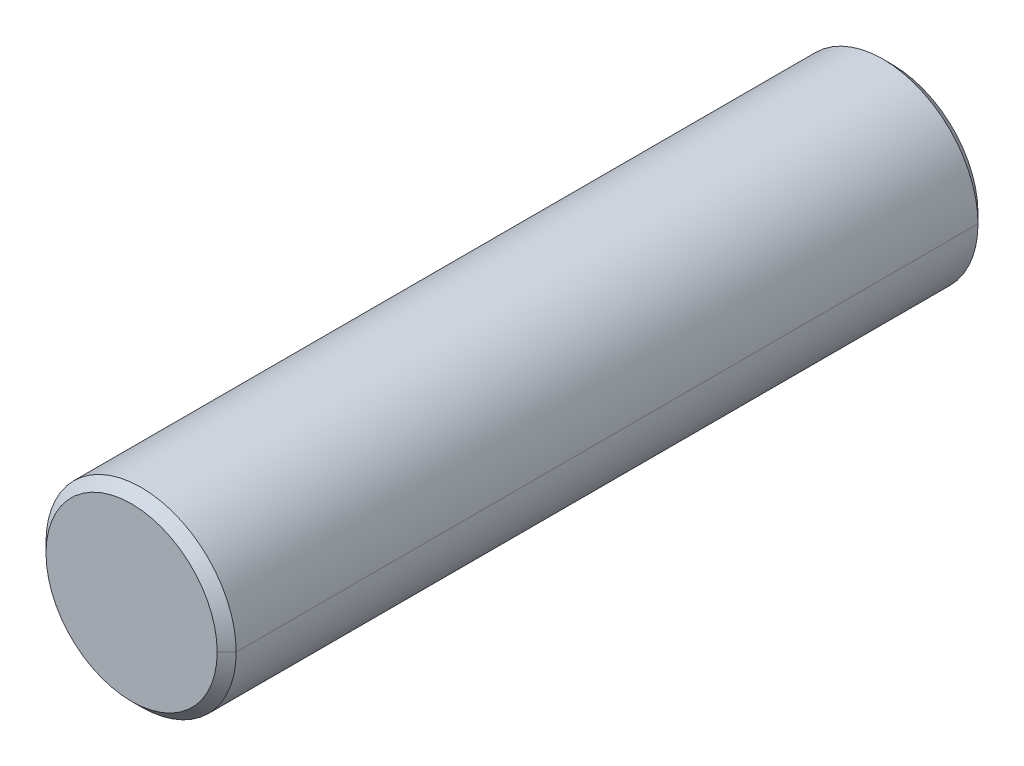
ISO-10303-21;
HEADER;
FILE_DESCRIPTION(('STEP AP214'),'2;1');
FILE_NAME('part.step','',(''),(''),'','','');
FILE_SCHEMA(('AUTOMOTIVE_DESIGN { 1 0 10303 214 1 1 1 1 }'));
ENDSEC;
DATA;
#1=APPLICATION_CONTEXT('core data for automotive mechanical design processes');
#2=APPLICATION_PROTOCOL_DEFINITION('international standard','automotive_design',2000,#1);
#3=PRODUCT_CONTEXT('',#1,'mechanical');
#4=PRODUCT('Part','Part','',(#3));
#5=PRODUCT_RELATED_PRODUCT_CATEGORY('part','',(#4));
#6=PRODUCT_DEFINITION_FORMATION('','',#4);
#7=PRODUCT_DEFINITION_CONTEXT('part definition',#1,'design');
#8=PRODUCT_DEFINITION('design','',#6,#7);
#9=PRODUCT_DEFINITION_SHAPE('','',#8);
#10=(LENGTH_UNIT() NAMED_UNIT(*) SI_UNIT(.MILLI.,.METRE.));
#11=(NAMED_UNIT(*) PLANE_ANGLE_UNIT() SI_UNIT($,.RADIAN.));
#12=(NAMED_UNIT(*) SI_UNIT($,.STERADIAN.) SOLID_ANGLE_UNIT());
#13=UNCERTAINTY_MEASURE_WITH_UNIT(LENGTH_MEASURE(1.E-05),#10,'distance_accuracy_value','');
#14=(GEOMETRIC_REPRESENTATION_CONTEXT(3) GLOBAL_UNCERTAINTY_ASSIGNED_CONTEXT((#13)) GLOBAL_UNIT_ASSIGNED_CONTEXT((#10,
#11,#12)) REPRESENTATION_CONTEXT('',''));
#15=CARTESIAN_POINT('',(0.,0.,0.));
#16=DIRECTION('',(0.,0.,1.));
#17=DIRECTION('',(1.,0.,0.));
#18=AXIS2_PLACEMENT_3D('',#15,#16,#17);
#19=CARTESIAN_POINT('',(12.01043392265,4.974884620748,42.5));
#20=DIRECTION('',(0.,0.,1.));
#21=DIRECTION('',(-1.,0.,0.));
#22=AXIS2_PLACEMENT_3D('',#19,#20,#21);
#23=CYLINDRICAL_SURFACE('',#22,1.);
#24=DIRECTION('',(0.,0.,-1.));
#25=VECTOR('',#24,1.);
#26=CARTESIAN_POINT('',(13.01043392265,4.97488462107097,50.4));
#27=LINE('',#26,#25);
#28=CARTESIAN_POINT('',(13.01043392265,4.9748846210472,50.4));
#29=VERTEX_POINT('',#28);
#30=CARTESIAN_POINT('',(13.01043392265,4.97488462107097,42.6));
#31=VERTEX_POINT('',#30);
#32=EDGE_CURVE('E120',#29,#31,#27,.T.);
#33=ORIENTED_EDGE('',*,*,#32,.T.);
#34=CARTESIAN_POINT('',(12.01043392265,4.974884620748,42.6));
#35=DIRECTION('',(0.,0.,1.));
#36=DIRECTION('',(1.,2.99203206315E-10,0.));
#37=AXIS2_PLACEMENT_3D('',#34,#35,#36);
#38=CIRCLE('',#37,1.);
#39=CARTESIAN_POINT('',(12.01043392265,5.974884620748,42.6));
#40=VERTEX_POINT('',#39);
#41=EDGE_CURVE('E125',#31,#40,#38,.T.);
#42=ORIENTED_EDGE('',*,*,#41,.T.);
#43=CARTESIAN_POINT('',(12.01043392265,4.974884620748,42.6));
#44=DIRECTION('',(0.,0.,1.));
#45=DIRECTION('',(0.,1.,0.));
#46=AXIS2_PLACEMENT_3D('',#43,#44,#45);
#47=CIRCLE('',#46,1.);
#48=CARTESIAN_POINT('',(11.01043392265,4.974884620748,42.6));
#49=VERTEX_POINT('',#48);
#50=EDGE_CURVE('E126',#40,#49,#47,.T.);
#51=ORIENTED_EDGE('',*,*,#50,.T.);
#52=DIRECTION('',(0.,0.,-1.));
#53=VECTOR('',#52,1.);
#54=CARTESIAN_POINT('',(11.01043392265,4.97488462057463,50.4));
#55=LINE('',#54,#53);
#56=CARTESIAN_POINT('',(11.01043392265,4.974884620748,50.4));
#57=VERTEX_POINT('',#56);
#58=EDGE_CURVE('E115',#57,#49,#55,.T.);
#59=ORIENTED_EDGE('',*,*,#58,.F.);
#60=CARTESIAN_POINT('',(12.01043392265,4.974884620748,50.4));
#61=DIRECTION('',(0.,0.,-1.));
#62=DIRECTION('',(-1.,0.,0.));
#63=AXIS2_PLACEMENT_3D('',#60,#61,#62);
#64=CIRCLE('',#63,1.);
#65=CARTESIAN_POINT('',(12.01043392265,5.974884620748,50.4));
#66=VERTEX_POINT('',#65);
#67=EDGE_CURVE('E11',#57,#66,#64,.T.);
#68=ORIENTED_EDGE('',*,*,#67,.T.);
#69=CARTESIAN_POINT('',(12.01043392265,4.974884620748,50.4));
#70=DIRECTION('',(0.,0.,-1.));
#71=DIRECTION('',(0.,1.,0.));
#72=AXIS2_PLACEMENT_3D('',#69,#70,#71);
#73=CIRCLE('',#72,1.);
#74=EDGE_CURVE('E27',#66,#29,#73,.T.);
#75=ORIENTED_EDGE('',*,*,#74,.T.);
#76=EDGE_LOOP('',(#33,#42,#51,#59,#68,#75));
#77=FACE_BOUND('',#76,.T.);
#78=ADVANCED_FACE('F16',(#77),#23,.T.);
#79=CARTESIAN_POINT('',(12.01043392265,4.974884620748,50.45));
#80=DIRECTION('',(0.,0.,-1.));
#81=DIRECTION('',(0.,-1.,0.));
#82=AXIS2_PLACEMENT_3D('',#79,#80,#81);
#83=CONICAL_SURFACE('',#82,0.95,0.785398163397);
#84=DIRECTION('',(-0.707106781187048,-8.12663181269155E-10,0.707106781186048));
#85=VECTOR('',#84,1.);
#86=CARTESIAN_POINT('',(13.01043392265,4.97488462107097,50.4));
#87=LINE('',#86,#85);
#88=CARTESIAN_POINT('',(12.91043392265,4.974884620748,50.5));
#89=VERTEX_POINT('',#88);
#90=EDGE_CURVE('E94',#29,#89,#87,.T.);
#91=ORIENTED_EDGE('',*,*,#90,.F.);
#92=ORIENTED_EDGE('',*,*,#74,.F.);
#93=ORIENTED_EDGE('',*,*,#67,.F.);
#94=DIRECTION('',(0.707106781187048,-2.45180332399316E-10,0.707106781186048));
#95=VECTOR('',#94,1.);
#96=CARTESIAN_POINT('',(11.01043392265,4.97488462057463,50.4));
#97=LINE('',#96,#95);
#98=CARTESIAN_POINT('',(11.11043392265,4.974884620748,50.5));
#99=VERTEX_POINT('',#98);
#100=EDGE_CURVE('E101',#57,#99,#97,.T.);
#101=ORIENTED_EDGE('',*,*,#100,.T.);
#102=CARTESIAN_POINT('',(12.01043392265,4.974884620748,50.5));
#103=DIRECTION('',(0.,0.,-1.));
#104=DIRECTION('',(-1.,0.,0.));
#105=AXIS2_PLACEMENT_3D('',#102,#103,#104);
#106=CIRCLE('',#105,0.9);
#107=CARTESIAN_POINT('',(12.01043392265,5.874884620748,50.5));
#108=VERTEX_POINT('',#107);
#109=EDGE_CURVE('E84',#99,#108,#106,.T.);
#110=ORIENTED_EDGE('',*,*,#109,.T.);
#111=CARTESIAN_POINT('',(12.01043392265,4.974884620748,50.5));
#112=DIRECTION('',(0.,0.,-1.));
#113=DIRECTION('',(0.,1.,0.));
#114=AXIS2_PLACEMENT_3D('',#111,#112,#113);
#115=CIRCLE('',#114,0.9);
#116=EDGE_CURVE('E89',#108,#89,#115,.T.);
#117=ORIENTED_EDGE('',*,*,#116,.T.);
#118=EDGE_LOOP('',(#91,#92,#93,#101,#110,#117));
#119=FACE_BOUND('',#118,.T.);
#120=ADVANCED_FACE('F205',(#119),#83,.T.);
#121=CARTESIAN_POINT('',(12.01043392265,4.974884620748,50.5));
#122=DIRECTION('',(0.,0.,1.));
#123=DIRECTION('',(1.,0.,0.));
#124=AXIS2_PLACEMENT_3D('',#121,#122,#123);
#125=PLANE('',#124);
#126=CARTESIAN_POINT('',(12.01043392265,4.974884620748,50.5));
#127=DIRECTION('',(0.,0.,-1.));
#128=DIRECTION('',(0.,-1.,0.));
#129=AXIS2_PLACEMENT_3D('',#126,#127,#128);
#130=CIRCLE('',#129,0.9);
#131=CARTESIAN_POINT('',(12.01043392265,4.074884620748,50.5));
#132=VERTEX_POINT('',#131);
#133=EDGE_CURVE('E78',#132,#99,#130,.T.);
#134=ORIENTED_EDGE('',*,*,#133,.F.);
#135=CARTESIAN_POINT('',(12.01043392265,4.974884620748,50.5));
#136=DIRECTION('',(0.,0.,-1.));
#137=DIRECTION('',(1.,0.,0.));
#138=AXIS2_PLACEMENT_3D('',#135,#136,#137);
#139=CIRCLE('',#138,0.9);
#140=EDGE_CURVE('E82',#89,#132,#139,.T.);
#141=ORIENTED_EDGE('',*,*,#140,.F.);
#142=ORIENTED_EDGE('',*,*,#116,.F.);
#143=ORIENTED_EDGE('',*,*,#109,.F.);
#144=EDGE_LOOP('',(#134,#141,#142,#143));
#145=FACE_BOUND('',#144,.T.);
#146=ADVANCED_FACE('F80',(#145),#125,.T.);
#147=CARTESIAN_POINT('',(12.01043392265,4.974884620748,50.45));
#148=DIRECTION('',(0.,0.,-1.));
#149=DIRECTION('',(0.,-1.,0.));
#150=AXIS2_PLACEMENT_3D('',#147,#148,#149);
#151=CONICAL_SURFACE('',#150,0.95,0.785398163397);
#152=ORIENTED_EDGE('',*,*,#100,.F.);
#153=CARTESIAN_POINT('',(12.01043392265,4.974884620748,50.4));
#154=DIRECTION('',(0.,0.,-1.));
#155=DIRECTION('',(0.,-1.,0.));
#156=AXIS2_PLACEMENT_3D('',#153,#154,#155);
#157=CIRCLE('',#156,1.);
#158=CARTESIAN_POINT('',(12.01043392265,3.974884620748,50.4));
#159=VERTEX_POINT('',#158);
#160=EDGE_CURVE('E119',#159,#57,#157,.T.);
#161=ORIENTED_EDGE('',*,*,#160,.F.);
#162=CARTESIAN_POINT('',(12.01043392265,4.974884620748,50.4));
#163=DIRECTION('',(0.,0.,-1.));
#164=DIRECTION('',(1.,2.99203206315E-10,0.));
#165=AXIS2_PLACEMENT_3D('',#162,#163,#164);
#166=CIRCLE('',#165,1.);
#167=EDGE_CURVE('E116',#29,#159,#166,.T.);
#168=ORIENTED_EDGE('',*,*,#167,.F.);
#169=ORIENTED_EDGE('',*,*,#90,.T.);
#170=ORIENTED_EDGE('',*,*,#140,.T.);
#171=ORIENTED_EDGE('',*,*,#133,.T.);
#172=EDGE_LOOP('',(#152,#161,#168,#169,#170,#171));
#173=FACE_BOUND('',#172,.T.);
#174=ADVANCED_FACE('F91',(#173),#151,.T.);
#175=CARTESIAN_POINT('',(12.01043392265,4.974884620748,42.5));
#176=DIRECTION('',(0.,0.,1.));
#177=DIRECTION('',(-1.,0.,0.));
#178=AXIS2_PLACEMENT_3D('',#175,#176,#177);
#179=CYLINDRICAL_SURFACE('',#178,1.);
#180=ORIENTED_EDGE('',*,*,#58,.T.);
#181=CARTESIAN_POINT('',(12.01043392265,4.974884620748,42.6));
#182=DIRECTION('',(0.,0.,1.));
#183=DIRECTION('',(-1.,0.,0.));
#184=AXIS2_PLACEMENT_3D('',#181,#182,#183);
#185=CIRCLE('',#184,1.);
#186=CARTESIAN_POINT('',(12.01043392265,3.974884620748,42.6));
#187=VERTEX_POINT('',#186);
#188=EDGE_CURVE('E111',#49,#187,#185,.T.);
#189=ORIENTED_EDGE('',*,*,#188,.T.);
#190=CARTESIAN_POINT('',(12.01043392265,4.974884620748,42.6));
#191=DIRECTION('',(0.,0.,1.));
#192=DIRECTION('',(0.,-1.,0.));
#193=AXIS2_PLACEMENT_3D('',#190,#191,#192);
#194=CIRCLE('',#193,1.);
#195=EDGE_CURVE('E105',#187,#31,#194,.T.);
#196=ORIENTED_EDGE('',*,*,#195,.T.);
#197=ORIENTED_EDGE('',*,*,#32,.F.);
#198=ORIENTED_EDGE('',*,*,#167,.T.);
#199=ORIENTED_EDGE('',*,*,#160,.T.);
#200=EDGE_LOOP('',(#180,#189,#196,#197,#198,#199));
#201=FACE_BOUND('',#200,.T.);
#202=ADVANCED_FACE('F167',(#201),#179,.T.);
#203=CARTESIAN_POINT('',(12.01043392265,4.974884620748,42.55));
#204=DIRECTION('',(0.,0.,1.));
#205=DIRECTION('',(0.,-1.,0.));
#206=AXIS2_PLACEMENT_3D('',#203,#204,#205);
#207=CONICAL_SURFACE('',#206,0.95,0.785398163397);
#208=DIRECTION('',(-0.707106781186548,-8.1266285107158E-10,-0.707106781186548));
#209=VECTOR('',#208,1.);
#210=CARTESIAN_POINT('',(13.01043392265,4.97488462107097,42.6));
#211=LINE('',#210,#209);
#212=CARTESIAN_POINT('',(12.91043392265,4.974884620748,42.5));
#213=VERTEX_POINT('',#212);
#214=EDGE_CURVE('E122',#31,#213,#211,.T.);
#215=ORIENTED_EDGE('',*,*,#214,.F.);
#216=ORIENTED_EDGE('',*,*,#195,.F.);
#217=ORIENTED_EDGE('',*,*,#188,.F.);
#218=DIRECTION('',(0.707106781186548,-2.45180505587043E-10,-0.707106781186548));
#219=VECTOR('',#218,1.);
#220=CARTESIAN_POINT('',(11.01043392265,4.97488462057463,42.6));
#221=LINE('',#220,#219);
#222=CARTESIAN_POINT('',(11.11043392265,4.974884620748,42.5));
#223=VERTEX_POINT('',#222);
#224=EDGE_CURVE('E130',#49,#223,#221,.T.);
#225=ORIENTED_EDGE('',*,*,#224,.T.);
#226=CARTESIAN_POINT('',(12.01043392265,4.974884620748,42.5));
#227=DIRECTION('',(0.,0.,1.));
#228=DIRECTION('',(-1.,0.,0.));
#229=AXIS2_PLACEMENT_3D('',#226,#227,#228);
#230=CIRCLE('',#229,0.9);
#231=CARTESIAN_POINT('',(12.01043392265,4.074884620748,42.5));
#232=VERTEX_POINT('',#231);
#233=EDGE_CURVE('E20',#223,#232,#230,.T.);
#234=ORIENTED_EDGE('',*,*,#233,.T.);
#235=CARTESIAN_POINT('',(12.01043392265,4.974884620748,42.5));
#236=DIRECTION('',(0.,0.,1.));
#237=DIRECTION('',(0.,-1.,0.));
#238=AXIS2_PLACEMENT_3D('',#235,#236,#237);
#239=CIRCLE('',#238,0.9);
#240=EDGE_CURVE('E184',#232,#213,#239,.T.);
#241=ORIENTED_EDGE('',*,*,#240,.T.);
#242=EDGE_LOOP('',(#215,#216,#217,#225,#234,#241));
#243=FACE_BOUND('',#242,.T.);
#244=ADVANCED_FACE('F18',(#243),#207,.T.);
#245=CARTESIAN_POINT('',(12.01043392265,4.974884620748,42.55));
#246=DIRECTION('',(0.,0.,1.));
#247=DIRECTION('',(0.,-1.,0.));
#248=AXIS2_PLACEMENT_3D('',#245,#246,#247);
#249=CONICAL_SURFACE('',#248,0.95,0.785398163397);
#250=ORIENTED_EDGE('',*,*,#224,.F.);
#251=ORIENTED_EDGE('',*,*,#50,.F.);
#252=ORIENTED_EDGE('',*,*,#41,.F.);
#253=ORIENTED_EDGE('',*,*,#214,.T.);
#254=CARTESIAN_POINT('',(12.01043392265,4.974884620748,42.5));
#255=DIRECTION('',(0.,0.,1.));
#256=DIRECTION('',(1.,0.,0.));
#257=AXIS2_PLACEMENT_3D('',#254,#255,#256);
#258=CIRCLE('',#257,0.9);
#259=CARTESIAN_POINT('',(12.01043392265,5.874884620748,42.5));
#260=VERTEX_POINT('',#259);
#261=EDGE_CURVE('E151',#213,#260,#258,.T.);
#262=ORIENTED_EDGE('',*,*,#261,.T.);
#263=CARTESIAN_POINT('',(12.01043392265,4.974884620748,42.5));
#264=DIRECTION('',(0.,0.,1.));
#265=DIRECTION('',(0.,1.,0.));
#266=AXIS2_PLACEMENT_3D('',#263,#264,#265);
#267=CIRCLE('',#266,0.9);
#268=EDGE_CURVE('E148',#260,#223,#267,.T.);
#269=ORIENTED_EDGE('',*,*,#268,.T.);
#270=EDGE_LOOP('',(#250,#251,#252,#253,#262,#269));
#271=FACE_BOUND('',#270,.T.);
#272=ADVANCED_FACE('F176',(#271),#249,.T.);
#273=CARTESIAN_POINT('',(12.01043392265,4.974884620748,42.5));
#274=DIRECTION('',(0.,0.,1.));
#275=DIRECTION('',(1.,0.,0.));
#276=AXIS2_PLACEMENT_3D('',#273,#274,#275);
#277=PLANE('',#276);
#278=ORIENTED_EDGE('',*,*,#240,.F.);
#279=ORIENTED_EDGE('',*,*,#233,.F.);
#280=ORIENTED_EDGE('',*,*,#268,.F.);
#281=ORIENTED_EDGE('',*,*,#261,.F.);
#282=EDGE_LOOP('',(#278,#279,#280,#281));
#283=FACE_BOUND('',#282,.T.);
#284=ADVANCED_FACE('F182',(#283),#277,.F.);
#285=CLOSED_SHELL('',(#78,#120,#146,#174,#202,#244,#272,#284));
#286=MANIFOLD_SOLID_BREP('B1',#285);
#287=ADVANCED_BREP_SHAPE_REPRESENTATION('',(#18,#286),#14);
#288=SHAPE_DEFINITION_REPRESENTATION(#9,#287);
ENDSEC;
END-ISO-10303-21;
